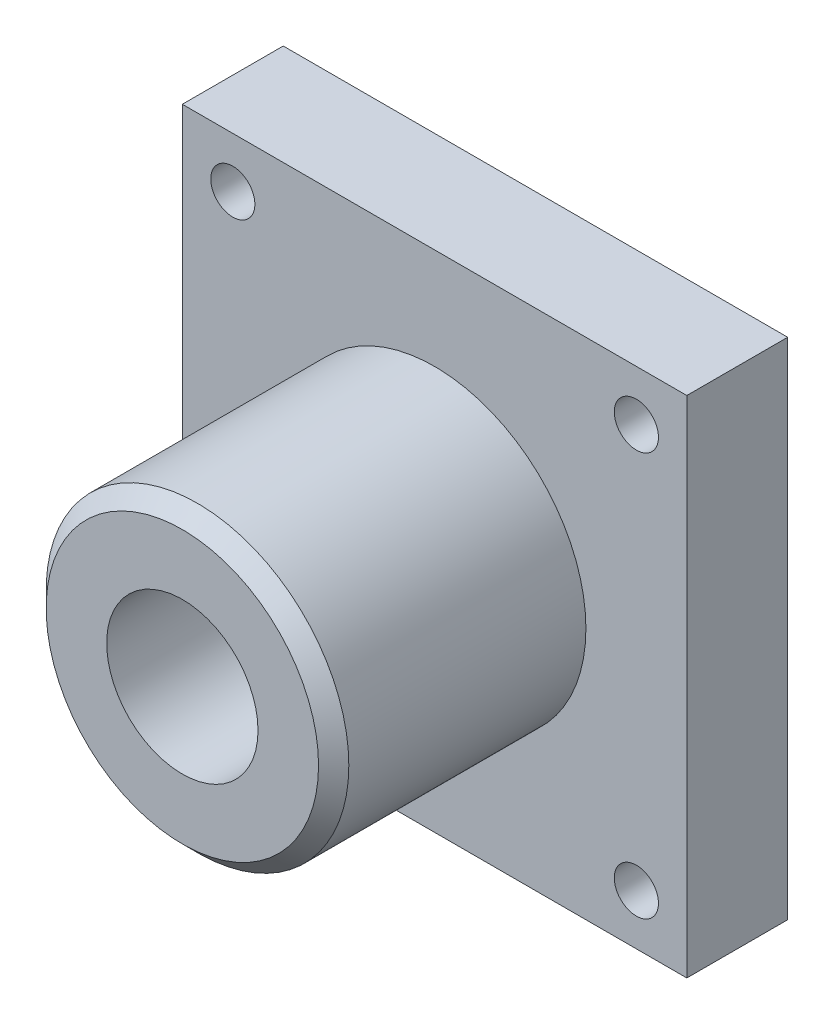
ISO-10303-21;
HEADER;
FILE_DESCRIPTION(('STEP AP214'),'2;1');
FILE_NAME('part.step','',(''),(''),'','','');
FILE_SCHEMA(('AUTOMOTIVE_DESIGN { 1 0 10303 214 1 1 1 1 }'));
ENDSEC;
DATA;
#1=APPLICATION_CONTEXT('core data for automotive mechanical design processes');
#2=APPLICATION_PROTOCOL_DEFINITION('international standard','automotive_design',2000,#1);
#3=PRODUCT_CONTEXT('',#1,'mechanical');
#4=PRODUCT('Part','Part','',(#3));
#5=PRODUCT_RELATED_PRODUCT_CATEGORY('part','',(#4));
#6=PRODUCT_DEFINITION_FORMATION('','',#4);
#7=PRODUCT_DEFINITION_CONTEXT('part definition',#1,'design');
#8=PRODUCT_DEFINITION('design','',#6,#7);
#9=PRODUCT_DEFINITION_SHAPE('','',#8);
#10=(LENGTH_UNIT() NAMED_UNIT(*) SI_UNIT(.MILLI.,.METRE.));
#11=(NAMED_UNIT(*) PLANE_ANGLE_UNIT() SI_UNIT($,.RADIAN.));
#12=(NAMED_UNIT(*) SI_UNIT($,.STERADIAN.) SOLID_ANGLE_UNIT());
#13=UNCERTAINTY_MEASURE_WITH_UNIT(LENGTH_MEASURE(1.E-05),#10,'distance_accuracy_value','');
#14=(GEOMETRIC_REPRESENTATION_CONTEXT(3) GLOBAL_UNCERTAINTY_ASSIGNED_CONTEXT((#13)) GLOBAL_UNIT_ASSIGNED_CONTEXT((#10,
#11,#12)) REPRESENTATION_CONTEXT('',''));
#15=CARTESIAN_POINT('',(0.,0.,0.));
#16=DIRECTION('',(0.,0.,1.));
#17=DIRECTION('',(1.,0.,0.));
#18=AXIS2_PLACEMENT_3D('',#15,#16,#17);
#19=CARTESIAN_POINT('',(127.,-127.,50.8));
#20=DIRECTION('',(0.,0.,1.));
#21=DIRECTION('',(1.,0.,0.));
#22=AXIS2_PLACEMENT_3D('',#19,#20,#21);
#23=PLANE('',#22);
#24=CARTESIAN_POINT('',(-101.6,101.6,50.8));
#25=DIRECTION('',(0.,0.,1.));
#26=DIRECTION('',(1.,0.,0.));
#27=AXIS2_PLACEMENT_3D('',#24,#25,#26);
#28=CIRCLE('',#27,11.1125);
#29=CARTESIAN_POINT('',(-90.4875,101.6,50.8));
#30=VERTEX_POINT('',#29);
#31=EDGE_CURVE('E266',#30,#30,#28,.T.);
#32=ORIENTED_EDGE('',*,*,#31,.F.);
#33=EDGE_LOOP('',(#32));
#34=FACE_BOUND('',#33,.T.);
#35=CARTESIAN_POINT('',(101.6,101.6,50.8));
#36=DIRECTION('',(0.,0.,1.));
#37=DIRECTION('',(1.,0.,0.));
#38=AXIS2_PLACEMENT_3D('',#35,#36,#37);
#39=CIRCLE('',#38,11.1125);
#40=CARTESIAN_POINT('',(112.7125,101.6,50.8));
#41=VERTEX_POINT('',#40);
#42=EDGE_CURVE('E268',#41,#41,#39,.T.);
#43=ORIENTED_EDGE('',*,*,#42,.F.);
#44=EDGE_LOOP('',(#43));
#45=FACE_BOUND('',#44,.T.);
#46=CARTESIAN_POINT('',(101.6,-101.6,50.8));
#47=DIRECTION('',(0.,0.,1.));
#48=DIRECTION('',(1.,0.,0.));
#49=AXIS2_PLACEMENT_3D('',#46,#47,#48);
#50=CIRCLE('',#49,11.1125);
#51=CARTESIAN_POINT('',(112.7125,-101.6,50.8));
#52=VERTEX_POINT('',#51);
#53=EDGE_CURVE('E276',#52,#52,#50,.T.);
#54=ORIENTED_EDGE('',*,*,#53,.F.);
#55=EDGE_LOOP('',(#54));
#56=FACE_BOUND('',#55,.T.);
#57=CARTESIAN_POINT('',(-101.6,-101.6,50.8));
#58=DIRECTION('',(0.,0.,1.));
#59=DIRECTION('',(1.,0.,0.));
#60=AXIS2_PLACEMENT_3D('',#57,#58,#59);
#61=CIRCLE('',#60,11.1125);
#62=CARTESIAN_POINT('',(-90.4875,-101.6,50.8));
#63=VERTEX_POINT('',#62);
#64=EDGE_CURVE('E282',#63,#63,#61,.T.);
#65=ORIENTED_EDGE('',*,*,#64,.F.);
#66=EDGE_LOOP('',(#65));
#67=FACE_BOUND('',#66,.T.);
#68=DIRECTION('',(0.,1.,0.));
#69=VECTOR('',#68,1.);
#70=CARTESIAN_POINT('',(127.,127.,50.8));
#71=LINE('',#70,#69);
#72=CARTESIAN_POINT('',(127.,-127.,50.8));
#73=VERTEX_POINT('',#72);
#74=CARTESIAN_POINT('',(127.,127.,50.8));
#75=VERTEX_POINT('',#74);
#76=EDGE_CURVE('E101',#73,#75,#71,.T.);
#77=ORIENTED_EDGE('',*,*,#76,.T.);
#78=DIRECTION('',(-1.,0.,0.));
#79=VECTOR('',#78,1.);
#80=CARTESIAN_POINT('',(-127.,127.,50.8));
#81=LINE('',#80,#79);
#82=CARTESIAN_POINT('',(-127.,127.,50.8));
#83=VERTEX_POINT('',#82);
#84=EDGE_CURVE('E96',#75,#83,#81,.T.);
#85=ORIENTED_EDGE('',*,*,#84,.T.);
#86=DIRECTION('',(0.,-1.,0.));
#87=VECTOR('',#86,1.);
#88=CARTESIAN_POINT('',(-127.,127.,50.8));
#89=LINE('',#88,#87);
#90=CARTESIAN_POINT('',(-127.,-127.,50.8));
#91=VERTEX_POINT('',#90);
#92=EDGE_CURVE('E99',#83,#91,#89,.T.);
#93=ORIENTED_EDGE('',*,*,#92,.T.);
#94=DIRECTION('',(1.,0.,0.));
#95=VECTOR('',#94,1.);
#96=CARTESIAN_POINT('',(-127.,-127.,50.8));
#97=LINE('',#96,#95);
#98=EDGE_CURVE('E65',#91,#73,#97,.T.);
#99=ORIENTED_EDGE('',*,*,#98,.T.);
#100=EDGE_LOOP('',(#77,#85,#93,#99));
#101=FACE_BOUND('',#100,.T.);
#102=CARTESIAN_POINT('',(0.,0.,50.8));
#103=DIRECTION('',(0.,0.,1.));
#104=DIRECTION('',(1.,0.,0.));
#105=AXIS2_PLACEMENT_3D('',#102,#103,#104);
#106=CIRCLE('',#105,76.2);
#107=CARTESIAN_POINT('',(76.2,0.,50.8));
#108=VERTEX_POINT('',#107);
#109=EDGE_CURVE('E119',#108,#108,#106,.T.);
#110=ORIENTED_EDGE('',*,*,#109,.F.);
#111=EDGE_LOOP('',(#110));
#112=FACE_BOUND('',#111,.T.);
#113=ADVANCED_FACE('F48',(#34,#45,#56,#67,#101,#112),#23,.T.);
#114=CARTESIAN_POINT('',(127.,127.,50.8));
#115=DIRECTION('',(-1.,0.,0.));
#116=DIRECTION('',(0.,-1.,0.));
#117=AXIS2_PLACEMENT_3D('',#114,#115,#116);
#118=PLANE('',#117);
#119=DIRECTION('',(0.,1.,0.));
#120=VECTOR('',#119,1.);
#121=CARTESIAN_POINT('',(127.,127.,0.));
#122=LINE('',#121,#120);
#123=CARTESIAN_POINT('',(127.,-127.,0.));
#124=VERTEX_POINT('',#123);
#125=CARTESIAN_POINT('',(127.,127.,0.));
#126=VERTEX_POINT('',#125);
#127=EDGE_CURVE('E116',#124,#126,#122,.T.);
#128=ORIENTED_EDGE('',*,*,#127,.T.);
#129=DIRECTION('',(0.,0.,-1.));
#130=VECTOR('',#129,1.);
#131=CARTESIAN_POINT('',(127.,127.,50.8));
#132=LINE('',#131,#130);
#133=EDGE_CURVE('E107',#75,#126,#132,.T.);
#134=ORIENTED_EDGE('',*,*,#133,.F.);
#135=ORIENTED_EDGE('',*,*,#76,.F.);
#136=DIRECTION('',(0.,0.,-1.));
#137=VECTOR('',#136,1.);
#138=CARTESIAN_POINT('',(127.,-127.,50.8));
#139=LINE('',#138,#137);
#140=EDGE_CURVE('E112',#73,#124,#139,.T.);
#141=ORIENTED_EDGE('',*,*,#140,.T.);
#142=EDGE_LOOP('',(#128,#134,#135,#141));
#143=FACE_BOUND('',#142,.T.);
#144=ADVANCED_FACE('F145',(#143),#118,.F.);
#145=CARTESIAN_POINT('',(-127.,127.,50.8));
#146=DIRECTION('',(0.,-1.,0.));
#147=DIRECTION('',(0.,0.,-1.));
#148=AXIS2_PLACEMENT_3D('',#145,#146,#147);
#149=PLANE('',#148);
#150=DIRECTION('',(-1.,0.,0.));
#151=VECTOR('',#150,1.);
#152=CARTESIAN_POINT('',(-127.,127.,0.));
#153=LINE('',#152,#151);
#154=CARTESIAN_POINT('',(-127.,127.,0.));
#155=VERTEX_POINT('',#154);
#156=EDGE_CURVE('E106',#126,#155,#153,.T.);
#157=ORIENTED_EDGE('',*,*,#156,.T.);
#158=DIRECTION('',(0.,0.,-1.));
#159=VECTOR('',#158,1.);
#160=CARTESIAN_POINT('',(-127.,127.,50.8));
#161=LINE('',#160,#159);
#162=EDGE_CURVE('E104',#83,#155,#161,.T.);
#163=ORIENTED_EDGE('',*,*,#162,.F.);
#164=ORIENTED_EDGE('',*,*,#84,.F.);
#165=ORIENTED_EDGE('',*,*,#133,.T.);
#166=EDGE_LOOP('',(#157,#163,#164,#165));
#167=FACE_BOUND('',#166,.T.);
#168=ADVANCED_FACE('F105',(#167),#149,.F.);
#169=CARTESIAN_POINT('',(-127.,127.,50.8));
#170=DIRECTION('',(1.,0.,0.));
#171=DIRECTION('',(0.,1.,0.));
#172=AXIS2_PLACEMENT_3D('',#169,#170,#171);
#173=PLANE('',#172);
#174=DIRECTION('',(0.,-1.,0.));
#175=VECTOR('',#174,1.);
#176=CARTESIAN_POINT('',(-127.,127.,0.));
#177=LINE('',#176,#175);
#178=CARTESIAN_POINT('',(-127.,-127.,0.));
#179=VERTEX_POINT('',#178);
#180=EDGE_CURVE('E82',#155,#179,#177,.T.);
#181=ORIENTED_EDGE('',*,*,#180,.T.);
#182=DIRECTION('',(0.,0.,-1.));
#183=VECTOR('',#182,1.);
#184=CARTESIAN_POINT('',(-127.,-127.,50.8));
#185=LINE('',#184,#183);
#186=EDGE_CURVE('E108',#91,#179,#185,.T.);
#187=ORIENTED_EDGE('',*,*,#186,.F.);
#188=ORIENTED_EDGE('',*,*,#92,.F.);
#189=ORIENTED_EDGE('',*,*,#162,.T.);
#190=EDGE_LOOP('',(#181,#187,#188,#189));
#191=FACE_BOUND('',#190,.T.);
#192=ADVANCED_FACE('F110',(#191),#173,.F.);
#193=CARTESIAN_POINT('',(-127.,-127.,50.8));
#194=DIRECTION('',(0.,1.,0.));
#195=DIRECTION('',(0.,0.,1.));
#196=AXIS2_PLACEMENT_3D('',#193,#194,#195);
#197=PLANE('',#196);
#198=DIRECTION('',(1.,0.,0.));
#199=VECTOR('',#198,1.);
#200=CARTESIAN_POINT('',(-127.,-127.,0.));
#201=LINE('',#200,#199);
#202=EDGE_CURVE('E88',#179,#124,#201,.T.);
#203=ORIENTED_EDGE('',*,*,#202,.T.);
#204=ORIENTED_EDGE('',*,*,#140,.F.);
#205=ORIENTED_EDGE('',*,*,#98,.F.);
#206=ORIENTED_EDGE('',*,*,#186,.T.);
#207=EDGE_LOOP('',(#203,#204,#205,#206));
#208=FACE_BOUND('',#207,.T.);
#209=ADVANCED_FACE('F159',(#208),#197,.F.);
#210=CARTESIAN_POINT('',(127.,-127.,0.));
#211=DIRECTION('',(0.,0.,1.));
#212=DIRECTION('',(1.,0.,0.));
#213=AXIS2_PLACEMENT_3D('',#210,#211,#212);
#214=PLANE('',#213);
#215=CARTESIAN_POINT('',(-101.6,101.6,0.));
#216=DIRECTION('',(0.,0.,1.));
#217=DIRECTION('',(1.,0.,0.));
#218=AXIS2_PLACEMENT_3D('',#215,#216,#217);
#219=CIRCLE('',#218,11.1125);
#220=CARTESIAN_POINT('',(-90.4875,101.6,0.));
#221=VERTEX_POINT('',#220);
#222=EDGE_CURVE('E264',#221,#221,#219,.T.);
#223=ORIENTED_EDGE('',*,*,#222,.T.);
#224=EDGE_LOOP('',(#223));
#225=FACE_BOUND('',#224,.T.);
#226=CARTESIAN_POINT('',(101.6,101.6,0.));
#227=DIRECTION('',(0.,0.,1.));
#228=DIRECTION('',(1.,0.,0.));
#229=AXIS2_PLACEMENT_3D('',#226,#227,#228);
#230=CIRCLE('',#229,11.1125);
#231=CARTESIAN_POINT('',(112.7125,101.6,0.));
#232=VERTEX_POINT('',#231);
#233=EDGE_CURVE('E273',#232,#232,#230,.T.);
#234=ORIENTED_EDGE('',*,*,#233,.T.);
#235=EDGE_LOOP('',(#234));
#236=FACE_BOUND('',#235,.T.);
#237=CARTESIAN_POINT('',(101.6,-101.6,0.));
#238=DIRECTION('',(0.,0.,1.));
#239=DIRECTION('',(1.,0.,0.));
#240=AXIS2_PLACEMENT_3D('',#237,#238,#239);
#241=CIRCLE('',#240,11.1125);
#242=CARTESIAN_POINT('',(112.7125,-101.6,0.));
#243=VERTEX_POINT('',#242);
#244=EDGE_CURVE('E279',#243,#243,#241,.T.);
#245=ORIENTED_EDGE('',*,*,#244,.T.);
#246=EDGE_LOOP('',(#245));
#247=FACE_BOUND('',#246,.T.);
#248=CARTESIAN_POINT('',(-101.6,-101.6,0.));
#249=DIRECTION('',(0.,0.,1.));
#250=DIRECTION('',(1.,0.,0.));
#251=AXIS2_PLACEMENT_3D('',#248,#249,#250);
#252=CIRCLE('',#251,11.1125);
#253=CARTESIAN_POINT('',(-90.4875,-101.6,0.));
#254=VERTEX_POINT('',#253);
#255=EDGE_CURVE('E285',#254,#254,#252,.T.);
#256=ORIENTED_EDGE('',*,*,#255,.T.);
#257=EDGE_LOOP('',(#256));
#258=FACE_BOUND('',#257,.T.);
#259=CARTESIAN_POINT('',(0.,0.,0.));
#260=DIRECTION('',(0.,0.,1.));
#261=DIRECTION('',(1.,0.,0.));
#262=AXIS2_PLACEMENT_3D('',#259,#260,#261);
#263=CIRCLE('',#262,38.1);
#264=CARTESIAN_POINT('',(38.1,0.,0.));
#265=VERTEX_POINT('',#264);
#266=EDGE_CURVE('E289',#265,#265,#263,.T.);
#267=ORIENTED_EDGE('',*,*,#266,.T.);
#268=EDGE_LOOP('',(#267));
#269=FACE_BOUND('',#268,.T.);
#270=ORIENTED_EDGE('',*,*,#127,.F.);
#271=ORIENTED_EDGE('',*,*,#202,.F.);
#272=ORIENTED_EDGE('',*,*,#180,.F.);
#273=ORIENTED_EDGE('',*,*,#156,.F.);
#274=EDGE_LOOP('',(#270,#271,#272,#273));
#275=FACE_BOUND('',#274,.T.);
#276=ADVANCED_FACE('F156',(#225,#236,#247,#258,#269,#275),#214,.F.);
#277=CARTESIAN_POINT('',(0.,0.,177.8));
#278=DIRECTION('',(0.,0.,-1.));
#279=DIRECTION('',(-1.,0.,0.));
#280=AXIS2_PLACEMENT_3D('',#277,#278,#279);
#281=CYLINDRICAL_SURFACE('',#280,76.2);
#282=CARTESIAN_POINT('',(0.,0.,170.18));
#283=DIRECTION('',(0.,0.,1.));
#284=DIRECTION('',(1.,0.,0.));
#285=AXIS2_PLACEMENT_3D('',#282,#283,#284);
#286=CIRCLE('',#285,76.2);
#287=CARTESIAN_POINT('',(76.2,0.,170.18));
#288=VERTEX_POINT('',#287);
#289=EDGE_CURVE('E13',#288,#288,#286,.F.);
#290=ORIENTED_EDGE('',*,*,#289,.T.);
#291=EDGE_LOOP('',(#290));
#292=FACE_BOUND('',#291,.T.);
#293=ORIENTED_EDGE('',*,*,#109,.T.);
#294=EDGE_LOOP('',(#293));
#295=FACE_BOUND('',#294,.T.);
#296=ADVANCED_FACE('F140',(#292,#295),#281,.T.);
#297=CARTESIAN_POINT('',(0.,0.,177.8));
#298=DIRECTION('',(0.,0.,1.));
#299=DIRECTION('',(1.,0.,0.));
#300=AXIS2_PLACEMENT_3D('',#297,#298,#299);
#301=PLANE('',#300);
#302=CARTESIAN_POINT('',(0.,0.,177.8));
#303=DIRECTION('',(0.,0.,1.));
#304=DIRECTION('',(1.,0.,0.));
#305=AXIS2_PLACEMENT_3D('',#302,#303,#304);
#306=CIRCLE('',#305,38.1);
#307=CARTESIAN_POINT('',(38.1,0.,177.8));
#308=VERTEX_POINT('',#307);
#309=EDGE_CURVE('E288',#308,#308,#306,.T.);
#310=ORIENTED_EDGE('',*,*,#309,.F.);
#311=EDGE_LOOP('',(#310));
#312=FACE_BOUND('',#311,.T.);
#313=CARTESIAN_POINT('',(0.,0.,177.8));
#314=DIRECTION('',(0.,0.,1.));
#315=DIRECTION('',(1.,0.,0.));
#316=AXIS2_PLACEMENT_3D('',#313,#314,#315);
#317=CIRCLE('',#316,68.5799999999999);
#318=CARTESIAN_POINT('',(68.5799999999999,0.,177.8));
#319=VERTEX_POINT('',#318);
#320=EDGE_CURVE('E57',#319,#319,#317,.T.);
#321=ORIENTED_EDGE('',*,*,#320,.T.);
#322=EDGE_LOOP('',(#321));
#323=FACE_BOUND('',#322,.T.);
#324=ADVANCED_FACE('F128',(#312,#323),#301,.T.);
#325=CARTESIAN_POINT('',(0.,0.,177.8));
#326=DIRECTION('',(0.,0.,-1.));
#327=DIRECTION('',(-1.,0.,0.));
#328=AXIS2_PLACEMENT_3D('',#325,#326,#327);
#329=CONICAL_SURFACE('',#328,68.5799999999999,0.785398163397451);
#330=ORIENTED_EDGE('',*,*,#289,.F.);
#331=EDGE_LOOP('',(#330));
#332=FACE_BOUND('',#331,.T.);
#333=ORIENTED_EDGE('',*,*,#320,.F.);
#334=EDGE_LOOP('',(#333));
#335=FACE_BOUND('',#334,.T.);
#336=ADVANCED_FACE('F50',(#332,#335),#329,.T.);
#337=CARTESIAN_POINT('',(0.,0.,0.));
#338=DIRECTION('',(0.,0.,1.));
#339=DIRECTION('',(1.,0.,0.));
#340=AXIS2_PLACEMENT_3D('',#337,#338,#339);
#341=CYLINDRICAL_SURFACE('',#340,38.1);
#342=ORIENTED_EDGE('',*,*,#266,.F.);
#343=EDGE_LOOP('',(#342));
#344=FACE_BOUND('',#343,.T.);
#345=ORIENTED_EDGE('',*,*,#309,.T.);
#346=EDGE_LOOP('',(#345));
#347=FACE_BOUND('',#346,.T.);
#348=ADVANCED_FACE('F131',(#344,#347),#341,.F.);
#349=CARTESIAN_POINT('',(-101.6,-101.6,50.8));
#350=DIRECTION('',(0.,0.,1.));
#351=DIRECTION('',(1.,0.,0.));
#352=AXIS2_PLACEMENT_3D('',#349,#350,#351);
#353=CYLINDRICAL_SURFACE('',#352,11.1125);
#354=ORIENTED_EDGE('',*,*,#255,.F.);
#355=EDGE_LOOP('',(#354));
#356=FACE_BOUND('',#355,.T.);
#357=ORIENTED_EDGE('',*,*,#64,.T.);
#358=EDGE_LOOP('',(#357));
#359=FACE_BOUND('',#358,.T.);
#360=ADVANCED_FACE('F137',(#356,#359),#353,.F.);
#361=CARTESIAN_POINT('',(101.6,-101.6,50.8));
#362=DIRECTION('',(0.,0.,1.));
#363=DIRECTION('',(1.,0.,0.));
#364=AXIS2_PLACEMENT_3D('',#361,#362,#363);
#365=CYLINDRICAL_SURFACE('',#364,11.1125);
#366=ORIENTED_EDGE('',*,*,#244,.F.);
#367=EDGE_LOOP('',(#366));
#368=FACE_BOUND('',#367,.T.);
#369=ORIENTED_EDGE('',*,*,#53,.T.);
#370=EDGE_LOOP('',(#369));
#371=FACE_BOUND('',#370,.T.);
#372=ADVANCED_FACE('F227',(#368,#371),#365,.F.);
#373=CARTESIAN_POINT('',(101.6,101.6,50.8));
#374=DIRECTION('',(0.,0.,1.));
#375=DIRECTION('',(1.,0.,0.));
#376=AXIS2_PLACEMENT_3D('',#373,#374,#375);
#377=CYLINDRICAL_SURFACE('',#376,11.1125);
#378=ORIENTED_EDGE('',*,*,#233,.F.);
#379=EDGE_LOOP('',(#378));
#380=FACE_BOUND('',#379,.T.);
#381=ORIENTED_EDGE('',*,*,#42,.T.);
#382=EDGE_LOOP('',(#381));
#383=FACE_BOUND('',#382,.T.);
#384=ADVANCED_FACE('F234',(#380,#383),#377,.F.);
#385=CARTESIAN_POINT('',(-101.6,101.6,50.8));
#386=DIRECTION('',(0.,0.,1.));
#387=DIRECTION('',(1.,0.,0.));
#388=AXIS2_PLACEMENT_3D('',#385,#386,#387);
#389=CYLINDRICAL_SURFACE('',#388,11.1125);
#390=ORIENTED_EDGE('',*,*,#222,.F.);
#391=EDGE_LOOP('',(#390));
#392=FACE_BOUND('',#391,.T.);
#393=ORIENTED_EDGE('',*,*,#31,.T.);
#394=EDGE_LOOP('',(#393));
#395=FACE_BOUND('',#394,.T.);
#396=ADVANCED_FACE('F242',(#392,#395),#389,.F.);
#397=CLOSED_SHELL('',(#113,#144,#168,#192,#209,#276,#296,#324,#336,#348,#360,#372,#384,#396));
#398=MANIFOLD_SOLID_BREP('B2',#397);
#399=ADVANCED_BREP_SHAPE_REPRESENTATION('',(#18,#398),#14);
#400=SHAPE_DEFINITION_REPRESENTATION(#9,#399);
ENDSEC;
END-ISO-10303-21;
